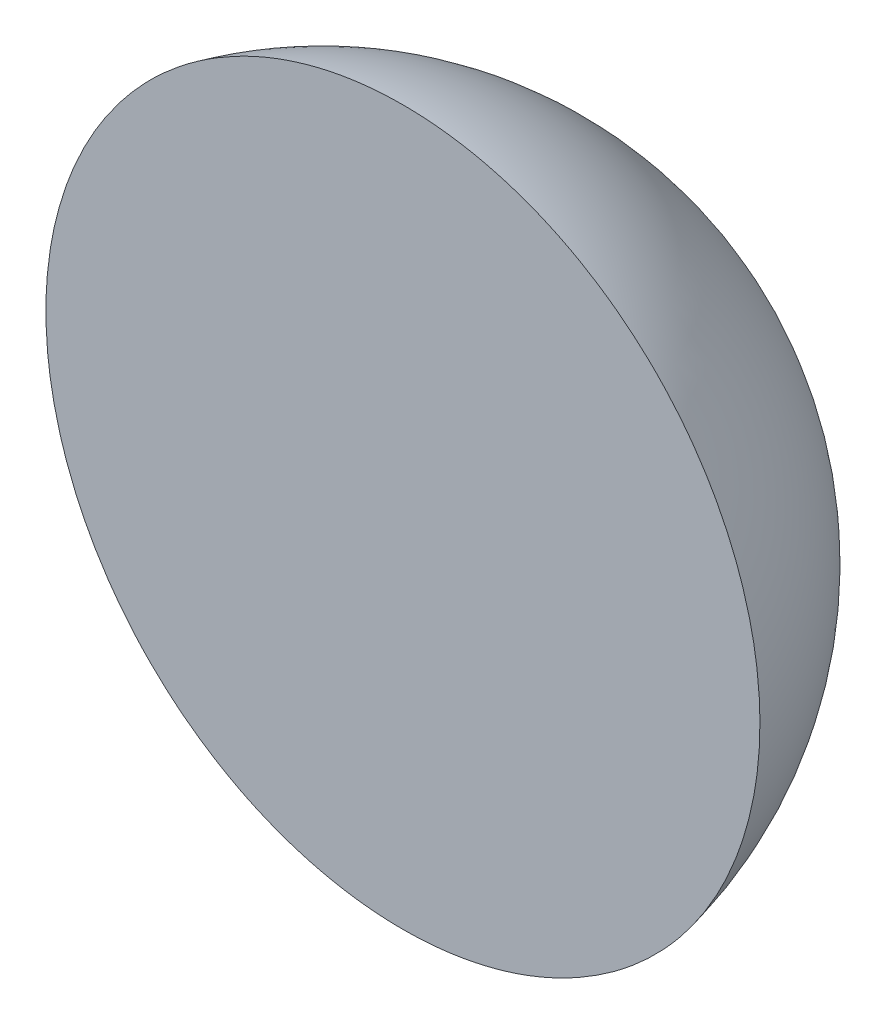
ISO-10303-21;
HEADER;
FILE_DESCRIPTION(('STEP AP214'),'2;1');
FILE_NAME('part.step','',(''),(''),'','','');
FILE_SCHEMA(('AUTOMOTIVE_DESIGN { 1 0 10303 214 1 1 1 1 }'));
ENDSEC;
DATA;
#1=APPLICATION_CONTEXT('core data for automotive mechanical design processes');
#2=APPLICATION_PROTOCOL_DEFINITION('international standard','automotive_design',2000,#1);
#3=PRODUCT_CONTEXT('',#1,'mechanical');
#4=PRODUCT('Part','Part','',(#3));
#5=PRODUCT_RELATED_PRODUCT_CATEGORY('part','',(#4));
#6=PRODUCT_DEFINITION_FORMATION('','',#4);
#7=PRODUCT_DEFINITION_CONTEXT('part definition',#1,'design');
#8=PRODUCT_DEFINITION('design','',#6,#7);
#9=PRODUCT_DEFINITION_SHAPE('','',#8);
#10=(LENGTH_UNIT() NAMED_UNIT(*) SI_UNIT(.MILLI.,.METRE.));
#11=(NAMED_UNIT(*) PLANE_ANGLE_UNIT() SI_UNIT($,.RADIAN.));
#12=(NAMED_UNIT(*) SI_UNIT($,.STERADIAN.) SOLID_ANGLE_UNIT());
#13=UNCERTAINTY_MEASURE_WITH_UNIT(LENGTH_MEASURE(1.E-05),#10,'distance_accuracy_value','');
#14=(GEOMETRIC_REPRESENTATION_CONTEXT(3) GLOBAL_UNCERTAINTY_ASSIGNED_CONTEXT((#13)) GLOBAL_UNIT_ASSIGNED_CONTEXT((#10,
#11,#12)) REPRESENTATION_CONTEXT('',''));
#15=CARTESIAN_POINT('',(0.,0.,0.));
#16=DIRECTION('',(0.,0.,1.));
#17=DIRECTION('',(1.,0.,0.));
#18=AXIS2_PLACEMENT_3D('',#15,#16,#17);
#19=CARTESIAN_POINT('',(-11.7,7.3,0.));
#20=DIRECTION('',(0.,0.,1.));
#21=DIRECTION('',(0.,-1.,0.));
#22=AXIS2_PLACEMENT_3D('',#19,#20,#21);
#23=PLANE('',#22);
#24=CARTESIAN_POINT('',(-11.7,9.8,0.));
#25=CARTESIAN_POINT('',(-11.6139455514433,9.80000403134242,0.));
#26=CARTESIAN_POINT('',(-11.5279318036478,9.79555432411686,0.));
#27=CARTESIAN_POINT('',(-11.3568206122334,9.77782681235029,0.));
#28=CARTESIAN_POINT('',(-11.2717231441002,9.76454924459128,0.));
#29=CARTESIAN_POINT('',(-11.05006239308,9.7181124670052,0.));
#30=CARTESIAN_POINT('',(-10.9149529883084,9.67769197487077,0.));
#31=CARTESIAN_POINT('',(-10.6533222966316,9.57470360836615,0.));
#32=CARTESIAN_POINT('',(-10.526811942798,9.51210814548982,0.));
#33=CARTESIAN_POINT('',(-10.2861496542259,9.3665870195652,0.));
#34=CARTESIAN_POINT('',(-10.1719916373701,9.28367142813211,0.));
#35=CARTESIAN_POINT('',(-9.95924979961854,9.09987419158671,0.));
#36=CARTESIAN_POINT('',(-9.86066197136848,8.99899718353333,0.));
#37=CARTESIAN_POINT('',(-9.68180811264509,8.78211314892315,0.));
#38=CARTESIAN_POINT('',(-9.60154407178978,8.66610448150019,0.));
#39=CARTESIAN_POINT('',(-9.46162840784527,8.42225382486244,0.));
#40=CARTESIAN_POINT('',(-9.40197762582472,8.29441135307083,0.));
#41=CARTESIAN_POINT('',(-9.30498697078382,8.03052884952334,0.));
#42=CARTESIAN_POINT('',(-9.2676466663302,7.89448897634233,0.));
#43=CARTESIAN_POINT('',(-9.21633529411417,7.6180715071491,0.));
#44=CARTESIAN_POINT('',(-9.20236417682689,7.47769392033016,0.));
#45=CARTESIAN_POINT('',(-9.19818759485787,7.1965853661205,0.));
#46=CARTESIAN_POINT('',(-9.20798217742989,7.05585439802771,0.));
#47=CARTESIAN_POINT('',(-9.25105902065884,6.77803456607964,0.));
#48=CARTESIAN_POINT('',(-9.28434123769008,6.64094569546007,0.));
#49=CARTESIAN_POINT('',(-9.3734485349277,6.37430127667993,0.));
#50=CARTESIAN_POINT('',(-9.42927362376711,6.24474573140435,0.));
#51=CARTESIAN_POINT('',(-9.56188203006087,5.99684558207275,0.));
#52=CARTESIAN_POINT('',(-9.6386653703903,5.8785009902532,0.));
#53=CARTESIAN_POINT('',(-9.81101056770387,5.65638240414632,0.));
#54=CARTESIAN_POINT('',(-9.90657241837392,5.55260840495977,0.));
#55=CARTESIAN_POINT('',(-10.1137618883324,5.3625768367346,0.));
#56=CARTESIAN_POINT('',(-10.2253895008895,5.27631926035689,0.));
#57=CARTESIAN_POINT('',(-10.4615417629262,5.1237690700077,0.));
#58=CARTESIAN_POINT('',(-10.586066414233,5.05747645886477,0.));
#59=CARTESIAN_POINT('',(-10.844477870096,4.9467380603429,0.));
#60=CARTESIAN_POINT('',(-10.9783646759221,4.90229227592711,0.));
#61=CARTESIAN_POINT('',(-11.2516997663939,4.83650923081357,0.));
#62=CARTESIAN_POINT('',(-11.3911480507958,4.81517196910238,0.));
#63=CARTESIAN_POINT('',(-11.671647570272,4.79621166879079,0.));
#64=CARTESIAN_POINT('',(-11.8126988052695,4.79858862905396,0.));
#65=CARTESIAN_POINT('',(-12.0924002026312,4.82698929474284,0.));
#66=CARTESIAN_POINT('',(-12.2310503649996,4.85301300012886,0.));
#67=CARTESIAN_POINT('',(-12.502013754003,4.92796842177054,0.));
#68=CARTESIAN_POINT('',(-12.6343269803131,4.97690013920087,0.));
#69=CARTESIAN_POINT('',(-12.8888605123491,5.09628256042103,0.));
#70=CARTESIAN_POINT('',(-13.0110808175747,5.16673326527758,0.));
#71=CARTESIAN_POINT('',(-13.2419590069081,5.32715375997783,0.));
#72=CARTESIAN_POINT('',(-13.350616893056,5.41712354688544,0.));
#73=CARTESIAN_POINT('',(-13.5512857728313,5.6140282189287,0.));
#74=CARTESIAN_POINT('',(-13.6432967690449,5.72096310142873,0.));
#75=CARTESIAN_POINT('',(-13.8080600072119,5.94876246211794,0.));
#76=CARTESIAN_POINT('',(-13.8808122402845,6.06962694673048,0.));
#77=CARTESIAN_POINT('',(-14.0049926958412,6.32185452832339,0.));
#78=CARTESIAN_POINT('',(-14.0564209106753,6.45321762907006,0.));
#79=CARTESIAN_POINT('',(-14.1364933469158,6.72271322906287,0.));
#80=CARTESIAN_POINT('',(-14.1651375951758,6.86084572033029,0.));
#81=CARTESIAN_POINT('',(-14.1988290693158,7.13995902450172,0.));
#82=CARTESIAN_POINT('',(-14.2038763035114,7.28093983640197,0.));
#83=CARTESIAN_POINT('',(-14.1902304815708,7.56174807162868,0.));
#84=CARTESIAN_POINT('',(-14.1715373807217,7.70157549278232,0.));
#85=CARTESIAN_POINT('',(-14.1109415359002,7.97610703409784,0.));
#86=CARTESIAN_POINT('',(-14.0690388503395,8.11081116715261,0.));
#87=CARTESIAN_POINT('',(-13.963213186851,8.37127306719773,0.));
#88=CARTESIAN_POINT('',(-13.8992901395603,8.49703080600594,0.));
#89=CARTESIAN_POINT('',(-13.7512367432758,8.73603228064816,0.));
#90=CARTESIAN_POINT('',(-13.6671059369331,8.84927573316983,0.));
#91=CARTESIAN_POINT('',(-13.4810304271131,9.06002537111934,0.));
#92=CARTESIAN_POINT('',(-13.3790865863429,9.15753231824559,0.));
#93=CARTESIAN_POINT('',(-13.1602904455364,9.33403701196261,0.));
#94=CARTESIAN_POINT('',(-13.0434400012817,9.41303705908347,0.));
#95=CARTESIAN_POINT('',(-12.7980973117763,9.5503212288974,0.));
#96=CARTESIAN_POINT('',(-12.6696016168778,9.60859918779378,0.));
#97=CARTESIAN_POINT('',(-12.4029953656039,9.70334548908961,0.));
#98=CARTESIAN_POINT('',(-12.2647844114312,9.73953105230187,0.));
#99=CARTESIAN_POINT('',(-11.9843417991869,9.787839927959,0.));
#100=CARTESIAN_POINT('',(-11.8421153976548,9.79999334240308,0.));
#101=CARTESIAN_POINT('',(-11.7,9.8,0.));
#102=B_SPLINE_CURVE_WITH_KNOTS('',3,(#24,#25,#26,#27,#28,#29,#30,#31,#32,#33,#34,#35,#36,#37,
#38,#39,#40,#41,#42,#43,#44,#45,#46,#47,#48,#49,#50,#51,#52,#53,#54,#55,#56,#57,#58,#59,#60,#61,
#62,#63,#64,#65,#66,#67,#68,#69,#70,#71,#72,#73,#74,#75,#76,#77,#78,#79,#80,#81,#82,#83,#84,#85,
#86,#87,#88,#89,#90,#91,#92,#93,#94,#95,#96,#97,#98,#99,#100,#101),.UNSPECIFIED.,.T.,.F.,(4,2,2,
2,2,2,2,2,2,2,2,2,2,2,2,2,2,2,2,2,2,2,2,2,2,2,2,2,2,2,2,2,2,2,2,2,2,2,4),(0.,0.257968512708987,
0.515930106432869,0.936878819490908,1.35835309665839,1.7796188922792,2.2007760879254,
2.62197899157971,3.04319907925819,3.46441102124611,3.88562207058456,4.30683395742501,
4.72804506191291,5.14925632770841,5.57046805324073,5.99167963714494,6.41289104456868,
6.83410251166775,7.2553140358966,7.67652554165311,8.09773702722453,8.51894851208906,
8.94016001855245,9.36137154589593,9.78258300988038,10.2037944084274,10.6250060012083,
11.0462177450964,11.4674289925361,11.8886400915418,12.3098519838645,12.7310628161267,
13.1522749751907,13.5734966681714,13.9946979665238,14.4158468789534,14.8371209577739,
15.2636800273766,15.6897044616848),.UNSPECIFIED.);
#103=CARTESIAN_POINT('',(-11.7,9.8,0.));
#104=VERTEX_POINT('',#103);
#105=EDGE_CURVE('E10',#104,#104,#102,.T.);
#106=ORIENTED_EDGE('',*,*,#105,.F.);
#107=EDGE_LOOP('',(#106));
#108=FACE_BOUND('',#107,.T.);
#109=ADVANCED_FACE('F15',(#108),#23,.T.);
#110=CARTESIAN_POINT('',(-11.7,7.3,0.5625));
#111=DIRECTION('',(0.,1.,0.));
#112=DIRECTION('',(-1.,0.,0.));
#113=AXIS2_PLACEMENT_3D('',#110,#111,#112);
#114=SPHERICAL_SURFACE('',#113,2.5625);
#115=ORIENTED_EDGE('',*,*,#105,.T.);
#116=EDGE_LOOP('',(#115));
#117=FACE_BOUND('',#116,.T.);
#118=ADVANCED_FACE('F26',(#117),#114,.T.);
#119=CLOSED_SHELL('',(#109,#118));
#120=MANIFOLD_SOLID_BREP('B1',#119);
#121=ADVANCED_BREP_SHAPE_REPRESENTATION('',(#18,#120),#14);
#122=SHAPE_DEFINITION_REPRESENTATION(#9,#121);
ENDSEC;
END-ISO-10303-21;
